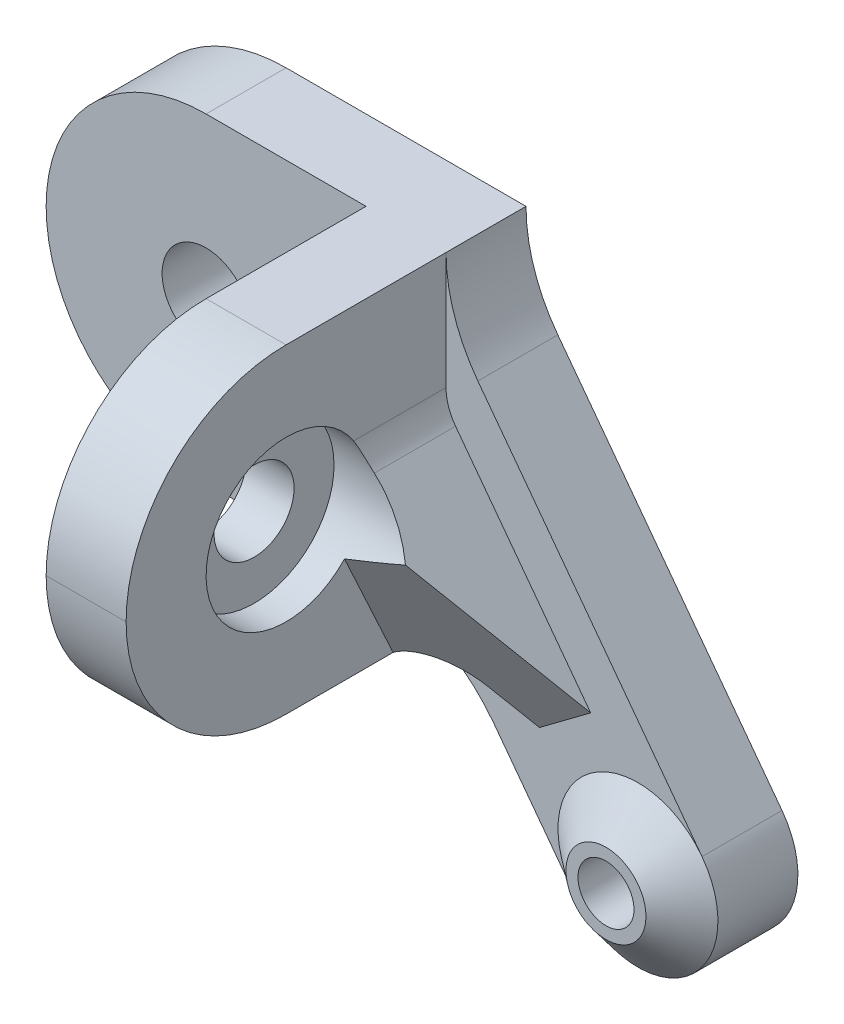
ISO-10303-21;
HEADER;
FILE_DESCRIPTION(('STEP AP214'),'2;1');
FILE_NAME('part.step','',(''),(''),'','','');
FILE_SCHEMA(('AUTOMOTIVE_DESIGN { 1 0 10303 214 1 1 1 1 }'));
ENDSEC;
DATA;
#1=APPLICATION_CONTEXT('core data for automotive mechanical design processes');
#2=APPLICATION_PROTOCOL_DEFINITION('international standard','automotive_design',2000,#1);
#3=PRODUCT_CONTEXT('',#1,'mechanical');
#4=PRODUCT('Part','Part','',(#3));
#5=PRODUCT_RELATED_PRODUCT_CATEGORY('part','',(#4));
#6=PRODUCT_DEFINITION_FORMATION('','',#4);
#7=PRODUCT_DEFINITION_CONTEXT('part definition',#1,'design');
#8=PRODUCT_DEFINITION('design','',#6,#7);
#9=PRODUCT_DEFINITION_SHAPE('','',#8);
#10=(LENGTH_UNIT() NAMED_UNIT(*) SI_UNIT(.MILLI.,.METRE.));
#11=(NAMED_UNIT(*) PLANE_ANGLE_UNIT() SI_UNIT($,.RADIAN.));
#12=(NAMED_UNIT(*) SI_UNIT($,.STERADIAN.) SOLID_ANGLE_UNIT());
#13=UNCERTAINTY_MEASURE_WITH_UNIT(LENGTH_MEASURE(1.E-05),#10,'distance_accuracy_value','');
#14=(GEOMETRIC_REPRESENTATION_CONTEXT(3) GLOBAL_UNCERTAINTY_ASSIGNED_CONTEXT((#13)) GLOBAL_UNIT_ASSIGNED_CONTEXT((#10,
#11,#12)) REPRESENTATION_CONTEXT('',''));
#15=CARTESIAN_POINT('',(0.,0.,0.));
#16=DIRECTION('',(0.,0.,1.));
#17=DIRECTION('',(1.,0.,0.));
#18=AXIS2_PLACEMENT_3D('',#15,#16,#17);
#19=CARTESIAN_POINT('',(5.00000000000001,12.7,0.));
#20=DIRECTION('',(0.,1.,0.));
#21=DIRECTION('',(0.,0.,1.));
#22=AXIS2_PLACEMENT_3D('',#19,#20,#21);
#23=PLANE('',#22);
#24=DIRECTION('',(-1.,0.,0.));
#25=VECTOR('',#24,1.);
#26=CARTESIAN_POINT('',(5.00000000000001,12.7,0.));
#27=LINE('',#26,#25);
#28=CARTESIAN_POINT('',(24.9906375905158,12.7,0.));
#29=VERTEX_POINT('',#28);
#30=CARTESIAN_POINT('',(15.,12.7,0.));
#31=VERTEX_POINT('',#30);
#32=EDGE_CURVE('E416',#29,#31,#27,.T.);
#33=ORIENTED_EDGE('',*,*,#32,.F.);
#34=DIRECTION('',(0.,0.,1.));
#35=VECTOR('',#34,1.);
#36=CARTESIAN_POINT('',(24.9906375905158,12.7,5.));
#37=LINE('',#36,#35);
#38=CARTESIAN_POINT('',(24.9906375905158,12.7,4.99999999999999));
#39=VERTEX_POINT('',#38);
#40=EDGE_CURVE('E209',#29,#39,#37,.T.);
#41=ORIENTED_EDGE('',*,*,#40,.T.);
#42=DIRECTION('',(1.,0.,0.));
#43=VECTOR('',#42,1.);
#44=CARTESIAN_POINT('',(5.,12.7,4.99999999999999));
#45=LINE('',#44,#43);
#46=CARTESIAN_POINT('',(15.,12.7,4.99999999999999));
#47=VERTEX_POINT('',#46);
#48=EDGE_CURVE('E427',#47,#39,#45,.T.);
#49=ORIENTED_EDGE('',*,*,#48,.F.);
#50=DIRECTION('',(0.,0.,1.));
#51=VECTOR('',#50,1.);
#52=CARTESIAN_POINT('',(15.,12.7,0.));
#53=LINE('',#52,#51);
#54=EDGE_CURVE('E204',#47,#31,#53,.F.);
#55=ORIENTED_EDGE('',*,*,#54,.T.);
#56=EDGE_LOOP('',(#33,#41,#49,#55));
#57=FACE_BOUND('',#56,.T.);
#58=ADVANCED_FACE('F33',(#57),#23,.F.);
#59=CARTESIAN_POINT('',(5.,32.7,4.99999999999999));
#60=DIRECTION('',(0.,0.,-1.));
#61=DIRECTION('',(-1.,0.,0.));
#62=AXIS2_PLACEMENT_3D('',#59,#60,#61);
#63=PLANE('',#62);
#64=DIRECTION('',(0.598801388197791,-0.800897557426915,0.));
#65=VECTOR('',#64,1.);
#66=CARTESIAN_POINT('',(13.8470437257616,39.3146063442278,4.99999999999999));
#67=LINE('',#66,#65);
#68=CARTESIAN_POINT('',(34.1990968368741,12.0937114923126,4.99999999999999));
#69=VERTEX_POINT('',#68);
#70=CARTESIAN_POINT('',(35.8387488744465,9.90067497335245,5.));
#71=VERTEX_POINT('',#70);
#72=EDGE_CURVE('E273',#69,#71,#67,.T.);
#73=ORIENTED_EDGE('',*,*,#72,.F.);
#74=CARTESIAN_POINT('',(31.7964041645934,10.2973073277193,4.99999999999999));
#75=DIRECTION('',(0.,0.,-1.));
#76=DIRECTION('',(-1.,0.,0.));
#77=AXIS2_PLACEMENT_3D('',#74,#75,#76);
#78=CIRCLE('',#77,3.);
#79=CARTESIAN_POINT('',(30.,12.7,5.));
#80=VERTEX_POINT('',#79);
#81=EDGE_CURVE('E259',#69,#80,#78,.F.);
#82=ORIENTED_EDGE('',*,*,#81,.T.);
#83=DIRECTION('',(1.,0.,0.));
#84=VECTOR('',#83,1.);
#85=CARTESIAN_POINT('',(5.,12.7,4.99999999999999));
#86=LINE('',#85,#84);
#87=CARTESIAN_POINT('',(25.,12.7,5.));
#88=VERTEX_POINT('',#87);
#89=EDGE_CURVE('E206',#88,#80,#86,.T.);
#90=ORIENTED_EDGE('',*,*,#89,.F.);
#91=CARTESIAN_POINT('',(24.9906375905158,2.7,4.99999999999999));
#92=DIRECTION('',(0.,0.,-1.));
#93=DIRECTION('',(-1.,0.,0.));
#94=AXIS2_PLACEMENT_3D('',#91,#92,#93);
#95=CIRCLE('',#94,10.);
#96=CARTESIAN_POINT('',(32.999613164785,8.68801388197789,4.99999999999999));
#97=VERTEX_POINT('',#96);
#98=EDGE_CURVE('E239',#88,#97,#95,.T.);
#99=ORIENTED_EDGE('',*,*,#98,.T.);
#100=DIRECTION('',(0.598801388197791,-0.800897557426915,0.));
#101=VECTOR('',#100,1.);
#102=CARTESIAN_POINT('',(11.4443510534808,37.5182021796344,4.99999999999999));
#103=LINE('',#102,#101);
#104=CARTESIAN_POINT('',(37.9955122128654,2.00599305901105,4.99999999999999));
#105=VERTEX_POINT('',#104);
#106=EDGE_CURVE('E303',#97,#105,#103,.T.);
#107=ORIENTED_EDGE('',*,*,#106,.T.);
#108=CARTESIAN_POINT('',(42.,5.,4.99999999999999));
#109=DIRECTION('',(0.,0.,-1.));
#110=DIRECTION('',(-1.,0.,0.));
#111=AXIS2_PLACEMENT_3D('',#108,#109,#110);
#112=CIRCLE('',#111,5.);
#113=CARTESIAN_POINT('',(46.0044877871346,7.99400694098895,4.99999999999999));
#114=VERTEX_POINT('',#113);
#115=EDGE_CURVE('E195',#105,#114,#112,.T.);
#116=ORIENTED_EDGE('',*,*,#115,.T.);
#117=DIRECTION('',(-0.598801388197791,0.800897557426915,0.));
#118=VECTOR('',#117,1.);
#119=CARTESIAN_POINT('',(19.45332662775,43.5062160616123,4.99999999999999));
#120=LINE('',#119,#118);
#121=CARTESIAN_POINT('',(31.9909929589213,26.7370726721985,4.99999999999999));
#122=VERTEX_POINT('',#121);
#123=EDGE_CURVE('E306',#114,#122,#120,.T.);
#124=ORIENTED_EDGE('',*,*,#123,.T.);
#125=CARTESIAN_POINT('',(39.9999685331905,32.7250865541764,4.99999999999999));
#126=DIRECTION('',(0.,0.,-1.));
#127=DIRECTION('',(-1.,0.,0.));
#128=AXIS2_PLACEMENT_3D('',#125,#126,#127);
#129=CIRCLE('',#128,10.);
#130=CARTESIAN_POINT('',(30.,32.7,4.99999999999999));
#131=VERTEX_POINT('',#130);
#132=EDGE_CURVE('E243',#122,#131,#129,.T.);
#133=ORIENTED_EDGE('',*,*,#132,.T.);
#134=DIRECTION('',(0.,1.,0.));
#135=VECTOR('',#134,1.);
#136=CARTESIAN_POINT('',(30.,0.,4.99999999999999));
#137=LINE('',#136,#135);
#138=CARTESIAN_POINT('',(30.,25.3875245740242,4.99999999999999));
#139=VERTEX_POINT('',#138);
#140=EDGE_CURVE('E302',#139,#131,#137,.T.);
#141=ORIENTED_EDGE('',*,*,#140,.F.);
#142=CARTESIAN_POINT('',(33.,25.3875245740242,4.99999999999999));
#143=DIRECTION('',(0.,0.,-1.));
#144=DIRECTION('',(-1.,0.,0.));
#145=AXIS2_PLACEMENT_3D('',#142,#143,#144);
#146=CIRCLE('',#145,3.);
#147=CARTESIAN_POINT('',(30.5973073277193,23.5911204094308,4.99999999999999));
#148=VERTEX_POINT('',#147);
#149=EDGE_CURVE('E257',#139,#148,#146,.F.);
#150=ORIENTED_EDGE('',*,*,#149,.T.);
#151=DIRECTION('',(0.598801388197791,-0.800897557426915,0.));
#152=VECTOR('',#151,1.);
#153=CARTESIAN_POINT('',(17.0506339554692,41.7098118970189,4.99999999999999));
#154=LINE('',#153,#152);
#155=CARTESIAN_POINT('',(39.0423391041542,12.2958805261436,5.));
#156=VERTEX_POINT('',#155);
#157=EDGE_CURVE('E275',#148,#156,#154,.T.);
#158=ORIENTED_EDGE('',*,*,#157,.T.);
#159=DIRECTION('',(-0.800897557426915,-0.598801388197791,0.));
#160=VECTOR('',#159,1.);
#161=CARTESIAN_POINT('',(26.991705148685,3.28606862912467,4.99999999999999));
#162=LINE('',#161,#160);
#163=EDGE_CURVE('E448',#156,#71,#162,.T.);
#164=ORIENTED_EDGE('',*,*,#163,.T.);
#165=EDGE_LOOP('',(#73,#82,#90,#99,#107,#116,#124,#133,#141,#150,#158,#164));
#166=FACE_BOUND('',#165,.T.);
#167=ADVANCED_FACE('F281',(#166),#63,.F.);
#168=CARTESIAN_POINT('',(30.,0.,25.));
#169=DIRECTION('',(-1.,0.,0.));
#170=DIRECTION('',(0.,0.,1.));
#171=AXIS2_PLACEMENT_3D('',#168,#169,#170);
#172=PLANE('',#171);
#173=DIRECTION('',(0.,0.,1.));
#174=VECTOR('',#173,1.);
#175=CARTESIAN_POINT('',(30.,12.7,0.));
#176=LINE('',#175,#174);
#177=CARTESIAN_POINT('',(30.,12.7,8.30783445332814));
#178=VERTEX_POINT('',#177);
#179=CARTESIAN_POINT('',(30.,12.7,15.));
#180=VERTEX_POINT('',#179);
#181=EDGE_CURVE('E187',#178,#180,#176,.T.);
#182=ORIENTED_EDGE('',*,*,#181,.F.);
#183=DIRECTION('',(0.,0.907909670834868,0.419165873616306));
#184=VECTOR('',#183,1.);
#185=CARTESIAN_POINT('',(30.,8.58384018988373,6.40747610472154));
#186=LINE('',#185,#184);
#187=CARTESIAN_POINT('',(30.,19.2849251009991,11.3479781717226));
#188=VERTEX_POINT('',#187);
#189=EDGE_CURVE('E179',#178,#188,#186,.T.);
#190=ORIENTED_EDGE('',*,*,#189,.T.);
#191=CARTESIAN_POINT('',(30.,22.7,15.));
#192=DIRECTION('',(-1.,0.,0.));
#193=DIRECTION('',(0.,0.,1.));
#194=AXIS2_PLACEMENT_3D('',#191,#192,#193);
#195=CIRCLE('',#194,5.);
#196=CARTESIAN_POINT('',(30.,25.3875245740242,10.7836969198104));
#197=VERTEX_POINT('',#196);
#198=EDGE_CURVE('E166',#197,#188,#195,.F.);
#199=ORIENTED_EDGE('',*,*,#198,.F.);
#200=DIRECTION('',(0.,0.,-1.));
#201=VECTOR('',#200,1.);
#202=CARTESIAN_POINT('',(30.,25.3875245740242,25.));
#203=LINE('',#202,#201);
#204=EDGE_CURVE('E261',#197,#139,#203,.T.);
#205=ORIENTED_EDGE('',*,*,#204,.T.);
#206=ORIENTED_EDGE('',*,*,#140,.T.);
#207=DIRECTION('',(0.,0.,-1.));
#208=VECTOR('',#207,1.);
#209=CARTESIAN_POINT('',(30.,32.7,25.));
#210=LINE('',#209,#208);
#211=CARTESIAN_POINT('',(30.,32.7,15.));
#212=VERTEX_POINT('',#211);
#213=EDGE_CURVE('E313',#212,#131,#210,.T.);
#214=ORIENTED_EDGE('',*,*,#213,.F.);
#215=CARTESIAN_POINT('',(30.,22.7,15.));
#216=DIRECTION('',(-1.,0.,0.));
#217=DIRECTION('',(0.,0.,1.));
#218=AXIS2_PLACEMENT_3D('',#215,#216,#217);
#219=CIRCLE('',#218,10.);
#220=CARTESIAN_POINT('',(30.,22.7,25.));
#221=VERTEX_POINT('',#220);
#222=EDGE_CURVE('E219',#212,#221,#219,.F.);
#223=ORIENTED_EDGE('',*,*,#222,.T.);
#224=CARTESIAN_POINT('',(30.,22.7,15.));
#225=DIRECTION('',(-1.,0.,0.));
#226=DIRECTION('',(0.,0.,1.));
#227=AXIS2_PLACEMENT_3D('',#224,#225,#226);
#228=CIRCLE('',#227,10.);
#229=EDGE_CURVE('E217',#221,#180,#228,.F.);
#230=ORIENTED_EDGE('',*,*,#229,.T.);
#231=EDGE_LOOP('',(#182,#190,#199,#205,#206,#214,#223,#230));
#232=FACE_BOUND('',#231,.T.);
#233=ADVANCED_FACE('F185',(#232),#172,.F.);
#234=CARTESIAN_POINT('',(15.,22.7,4.99999999999999));
#235=DIRECTION('',(0.,0.,1.));
#236=DIRECTION('',(1.,0.,0.));
#237=AXIS2_PLACEMENT_3D('',#234,#235,#236);
#238=CIRCLE('',#237,2.75);
#239=CARTESIAN_POINT('',(17.75,22.7,4.99999999999999));
#240=VERTEX_POINT('',#239);
#241=EDGE_CURVE('E330',#240,#240,#238,.T.);
#242=ORIENTED_EDGE('',*,*,#241,.F.);
#243=EDGE_LOOP('',(#242));
#244=FACE_BOUND('',#243,.T.);
#245=DIRECTION('',(1.,0.,0.));
#246=VECTOR('',#245,1.);
#247=CARTESIAN_POINT('',(5.,32.7,4.99999999999999));
#248=LINE('',#247,#246);
#249=CARTESIAN_POINT('',(15.,32.7,4.99999999999999));
#250=VERTEX_POINT('',#249);
#251=CARTESIAN_POINT('',(25.,32.7,4.99999999999999));
#252=VERTEX_POINT('',#251);
#253=EDGE_CURVE('E336',#250,#252,#248,.T.);
#254=ORIENTED_EDGE('',*,*,#253,.F.);
#255=CARTESIAN_POINT('',(15.,22.7,4.99999999999999));
#256=DIRECTION('',(0.,0.,-1.));
#257=DIRECTION('',(-1.,0.,0.));
#258=AXIS2_PLACEMENT_3D('',#255,#256,#257);
#259=CIRCLE('',#258,10.);
#260=CARTESIAN_POINT('',(5.,22.7,4.99999999999999));
#261=VERTEX_POINT('',#260);
#262=EDGE_CURVE('E229',#250,#261,#259,.F.);
#263=ORIENTED_EDGE('',*,*,#262,.T.);
#264=CARTESIAN_POINT('',(15.,22.7,4.99999999999999));
#265=DIRECTION('',(0.,0.,-1.));
#266=DIRECTION('',(-1.,0.,0.));
#267=AXIS2_PLACEMENT_3D('',#264,#265,#266);
#268=CIRCLE('',#267,10.);
#269=EDGE_CURVE('E227',#261,#47,#268,.F.);
#270=ORIENTED_EDGE('',*,*,#269,.T.);
#271=ORIENTED_EDGE('',*,*,#48,.T.);
#272=EDGE_CURVE('E292',#39,#88,#45,.T.);
#273=ORIENTED_EDGE('',*,*,#272,.T.);
#274=DIRECTION('',(0.,-1.,0.));
#275=VECTOR('',#274,1.);
#276=CARTESIAN_POINT('',(25.,0.,4.99999999999999));
#277=LINE('',#276,#275);
#278=EDGE_CURVE('E295',#252,#88,#277,.T.);
#279=ORIENTED_EDGE('',*,*,#278,.F.);
#280=EDGE_LOOP('',(#254,#263,#270,#271,#273,#279));
#281=FACE_BOUND('',#280,.T.);
#282=ADVANCED_FACE('F345',(#244,#281),#63,.F.);
#283=CARTESIAN_POINT('',(15.,22.7,-5.00000000000001));
#284=DIRECTION('',(0.,0.,1.));
#285=DIRECTION('',(1.,0.,0.));
#286=AXIS2_PLACEMENT_3D('',#283,#284,#285);
#287=CYLINDRICAL_SURFACE('',#286,2.75);
#288=ORIENTED_EDGE('',*,*,#241,.T.);
#289=EDGE_LOOP('',(#288));
#290=FACE_BOUND('',#289,.T.);
#291=CARTESIAN_POINT('',(15.,22.7,0.999999999999998));
#292=DIRECTION('',(0.,0.,-1.));
#293=DIRECTION('',(-1.,0.,0.));
#294=AXIS2_PLACEMENT_3D('',#291,#292,#293);
#295=CIRCLE('',#294,2.75);
#296=CARTESIAN_POINT('',(12.25,22.7,0.999999999999999));
#297=VERTEX_POINT('',#296);
#298=EDGE_CURVE('E327',#297,#297,#295,.F.);
#299=ORIENTED_EDGE('',*,*,#298,.F.);
#300=EDGE_LOOP('',(#299));
#301=FACE_BOUND('',#300,.T.);
#302=ADVANCED_FACE('F342',(#290,#301),#287,.F.);
#303=CARTESIAN_POINT('',(47.,32.7,0.));
#304=DIRECTION('',(0.,0.,1.));
#305=DIRECTION('',(1.,0.,0.));
#306=AXIS2_PLACEMENT_3D('',#303,#304,#305);
#307=PLANE('',#306);
#308=CARTESIAN_POINT('',(42.,5.,0.));
#309=DIRECTION('',(0.,0.,-1.));
#310=DIRECTION('',(-1.,0.,0.));
#311=AXIS2_PLACEMENT_3D('',#308,#309,#310);
#312=CIRCLE('',#311,1.75);
#313=CARTESIAN_POINT('',(40.25,5.,0.));
#314=VERTEX_POINT('',#313);
#315=EDGE_CURVE('E320',#314,#314,#312,.T.);
#316=ORIENTED_EDGE('',*,*,#315,.F.);
#317=EDGE_LOOP('',(#316));
#318=FACE_BOUND('',#317,.T.);
#319=CARTESIAN_POINT('',(15.,22.7,0.));
#320=DIRECTION('',(0.,0.,-1.));
#321=DIRECTION('',(-1.,0.,0.));
#322=AXIS2_PLACEMENT_3D('',#319,#320,#321);
#323=CIRCLE('',#322,5.5);
#324=CARTESIAN_POINT('',(9.50000000000001,22.7,0.));
#325=VERTEX_POINT('',#324);
#326=EDGE_CURVE('E323',#325,#325,#323,.T.);
#327=ORIENTED_EDGE('',*,*,#326,.F.);
#328=EDGE_LOOP('',(#327));
#329=FACE_BOUND('',#328,.T.);
#330=CARTESIAN_POINT('',(15.,22.7,0.));
#331=DIRECTION('',(0.,0.,1.));
#332=DIRECTION('',(1.,0.,0.));
#333=AXIS2_PLACEMENT_3D('',#330,#331,#332);
#334=CIRCLE('',#333,10.);
#335=CARTESIAN_POINT('',(5.00000000000001,22.7,0.));
#336=VERTEX_POINT('',#335);
#337=EDGE_CURVE('E231',#31,#336,#334,.F.);
#338=ORIENTED_EDGE('',*,*,#337,.T.);
#339=CARTESIAN_POINT('',(15.,22.7,0.));
#340=DIRECTION('',(0.,0.,1.));
#341=DIRECTION('',(1.,0.,0.));
#342=AXIS2_PLACEMENT_3D('',#339,#340,#341);
#343=CIRCLE('',#342,10.);
#344=CARTESIAN_POINT('',(15.,32.7,0.));
#345=VERTEX_POINT('',#344);
#346=EDGE_CURVE('E233',#336,#345,#343,.F.);
#347=ORIENTED_EDGE('',*,*,#346,.T.);
#348=DIRECTION('',(-1.,0.,0.));
#349=VECTOR('',#348,1.);
#350=CARTESIAN_POINT('',(47.,32.7,0.));
#351=LINE('',#350,#349);
#352=CARTESIAN_POINT('',(30.,32.7,0.));
#353=VERTEX_POINT('',#352);
#354=EDGE_CURVE('E333',#353,#345,#351,.T.);
#355=ORIENTED_EDGE('',*,*,#354,.F.);
#356=CARTESIAN_POINT('',(39.9999685331905,32.7250865541764,0.));
#357=DIRECTION('',(0.,0.,1.));
#358=DIRECTION('',(1.,0.,0.));
#359=AXIS2_PLACEMENT_3D('',#356,#357,#358);
#360=CIRCLE('',#359,10.);
#361=CARTESIAN_POINT('',(31.9909929589213,26.7370726721985,0.));
#362=VERTEX_POINT('',#361);
#363=EDGE_CURVE('E246',#353,#362,#360,.T.);
#364=ORIENTED_EDGE('',*,*,#363,.T.);
#365=DIRECTION('',(0.598801388197791,-0.800897557426915,0.));
#366=VECTOR('',#365,1.);
#367=CARTESIAN_POINT('',(46.0044877871346,7.99400694098895,0.));
#368=LINE('',#367,#366);
#369=CARTESIAN_POINT('',(46.0044877871346,7.99400694098895,0.));
#370=VERTEX_POINT('',#369);
#371=EDGE_CURVE('E446',#362,#370,#368,.T.);
#372=ORIENTED_EDGE('',*,*,#371,.T.);
#373=CARTESIAN_POINT('',(42.,5.,0.));
#374=DIRECTION('',(0.,0.,-1.));
#375=DIRECTION('',(1.,0.,0.));
#376=AXIS2_PLACEMENT_3D('',#373,#374,#375);
#377=CIRCLE('',#376,4.99999999999999);
#378=CARTESIAN_POINT('',(37.9955122128654,2.00599305901105,0.));
#379=VERTEX_POINT('',#378);
#380=EDGE_CURVE('E443',#370,#379,#377,.T.);
#381=ORIENTED_EDGE('',*,*,#380,.T.);
#382=DIRECTION('',(-0.598801388197791,0.800897557426915,0.));
#383=VECTOR('',#382,1.);
#384=CARTESIAN_POINT('',(30.,12.7,0.));
#385=LINE('',#384,#383);
#386=CARTESIAN_POINT('',(32.999613164785,8.68801388197791,0.));
#387=VERTEX_POINT('',#386);
#388=EDGE_CURVE('E440',#379,#387,#385,.T.);
#389=ORIENTED_EDGE('',*,*,#388,.T.);
#390=CARTESIAN_POINT('',(24.9906375905158,2.7,0.));
#391=DIRECTION('',(0.,0.,1.));
#392=DIRECTION('',(1.,0.,0.));
#393=AXIS2_PLACEMENT_3D('',#390,#391,#392);
#394=CIRCLE('',#393,10.);
#395=EDGE_CURVE('E241',#387,#29,#394,.T.);
#396=ORIENTED_EDGE('',*,*,#395,.T.);
#397=ORIENTED_EDGE('',*,*,#32,.T.);
#398=EDGE_LOOP('',(#338,#347,#355,#364,#372,#381,#389,#396,#397));
#399=FACE_BOUND('',#398,.T.);
#400=ADVANCED_FACE('F344',(#318,#329,#399),#307,.F.);
#401=CARTESIAN_POINT('',(0.,32.7,0.));
#402=DIRECTION('',(0.,1.,0.));
#403=DIRECTION('',(0.,0.,1.));
#404=AXIS2_PLACEMENT_3D('',#401,#402,#403);
#405=PLANE('',#404);
#406=ORIENTED_EDGE('',*,*,#354,.T.);
#407=DIRECTION('',(0.,0.,1.));
#408=VECTOR('',#407,1.);
#409=CARTESIAN_POINT('',(15.,32.7,4.99999999999999));
#410=LINE('',#409,#408);
#411=EDGE_CURVE('E224',#345,#250,#410,.T.);
#412=ORIENTED_EDGE('',*,*,#411,.T.);
#413=ORIENTED_EDGE('',*,*,#253,.T.);
#414=DIRECTION('',(0.,0.,-1.));
#415=VECTOR('',#414,1.);
#416=CARTESIAN_POINT('',(25.,32.7,25.));
#417=LINE('',#416,#415);
#418=CARTESIAN_POINT('',(25.,32.7,15.));
#419=VERTEX_POINT('',#418);
#420=EDGE_CURVE('E298',#419,#252,#417,.T.);
#421=ORIENTED_EDGE('',*,*,#420,.F.);
#422=DIRECTION('',(-1.,0.,0.));
#423=VECTOR('',#422,1.);
#424=CARTESIAN_POINT('',(30.,32.7,15.));
#425=LINE('',#424,#423);
#426=EDGE_CURVE('E221',#419,#212,#425,.F.);
#427=ORIENTED_EDGE('',*,*,#426,.T.);
#428=ORIENTED_EDGE('',*,*,#213,.T.);
#429=EDGE_CURVE('E311',#131,#353,#210,.T.);
#430=ORIENTED_EDGE('',*,*,#429,.T.);
#431=EDGE_LOOP('',(#406,#412,#413,#421,#427,#428,#430));
#432=FACE_BOUND('',#431,.T.);
#433=ADVANCED_FACE('F352',(#432),#405,.T.);
#434=CARTESIAN_POINT('',(15.,22.7,0.999999999999998));
#435=DIRECTION('',(0.,0.,-1.));
#436=DIRECTION('',(-1.,0.,0.));
#437=AXIS2_PLACEMENT_3D('',#434,#435,#436);
#438=PLANE('',#437);
#439=CARTESIAN_POINT('',(15.,22.7,0.999999999999998));
#440=DIRECTION('',(0.,0.,-1.));
#441=DIRECTION('',(-1.,0.,0.));
#442=AXIS2_PLACEMENT_3D('',#439,#440,#441);
#443=CIRCLE('',#442,5.5);
#444=CARTESIAN_POINT('',(9.50000000000001,22.7,0.999999999999999));
#445=VERTEX_POINT('',#444);
#446=EDGE_CURVE('E324',#445,#445,#443,.T.);
#447=ORIENTED_EDGE('',*,*,#446,.T.);
#448=EDGE_LOOP('',(#447));
#449=FACE_BOUND('',#448,.T.);
#450=ORIENTED_EDGE('',*,*,#298,.T.);
#451=EDGE_LOOP('',(#450));
#452=FACE_BOUND('',#451,.T.);
#453=ADVANCED_FACE('F340',(#449,#452),#438,.T.);
#454=CARTESIAN_POINT('',(15.,22.7,0.999999999999998));
#455=DIRECTION('',(0.,0.,-1.));
#456=DIRECTION('',(-1.,0.,0.));
#457=AXIS2_PLACEMENT_3D('',#454,#455,#456);
#458=CYLINDRICAL_SURFACE('',#457,5.5);
#459=ORIENTED_EDGE('',*,*,#446,.F.);
#460=EDGE_LOOP('',(#459));
#461=FACE_BOUND('',#460,.T.);
#462=ORIENTED_EDGE('',*,*,#326,.T.);
#463=EDGE_LOOP('',(#462));
#464=FACE_BOUND('',#463,.T.);
#465=ADVANCED_FACE('F398',(#461,#464),#458,.F.);
#466=CARTESIAN_POINT('',(42.,5.,12.));
#467=DIRECTION('',(0.,0.,-1.));
#468=DIRECTION('',(-1.,0.,0.));
#469=AXIS2_PLACEMENT_3D('',#466,#467,#468);
#470=CYLINDRICAL_SURFACE('',#469,1.75);
#471=ORIENTED_EDGE('',*,*,#315,.T.);
#472=EDGE_LOOP('',(#471));
#473=FACE_BOUND('',#472,.T.);
#474=CARTESIAN_POINT('',(42.,5.,6.99999999999999));
#475=DIRECTION('',(0.,0.,1.));
#476=DIRECTION('',(1.,0.,0.));
#477=AXIS2_PLACEMENT_3D('',#474,#475,#476);
#478=CIRCLE('',#477,1.75);
#479=CARTESIAN_POINT('',(43.75,5.,6.99999999999999));
#480=VERTEX_POINT('',#479);
#481=EDGE_CURVE('E314',#480,#480,#478,.T.);
#482=ORIENTED_EDGE('',*,*,#481,.T.);
#483=EDGE_LOOP('',(#482));
#484=FACE_BOUND('',#483,.T.);
#485=ADVANCED_FACE('F394',(#473,#484),#470,.F.);
#486=CARTESIAN_POINT('',(42.,5.,6.99999999999999));
#487=DIRECTION('',(0.,0.,1.));
#488=DIRECTION('',(1.,0.,0.));
#489=AXIS2_PLACEMENT_3D('',#486,#487,#488);
#490=PLANE('',#489);
#491=CARTESIAN_POINT('',(42.,5.,6.99999999999999));
#492=DIRECTION('',(0.,0.,1.));
#493=DIRECTION('',(1.,0.,0.));
#494=AXIS2_PLACEMENT_3D('',#491,#492,#493);
#495=CIRCLE('',#494,2.5);
#496=CARTESIAN_POINT('',(44.5,5.,6.99999999999999));
#497=VERTEX_POINT('',#496);
#498=EDGE_CURVE('E317',#497,#497,#495,.T.);
#499=ORIENTED_EDGE('',*,*,#498,.T.);
#500=EDGE_LOOP('',(#499));
#501=FACE_BOUND('',#500,.T.);
#502=ORIENTED_EDGE('',*,*,#481,.F.);
#503=EDGE_LOOP('',(#502));
#504=FACE_BOUND('',#503,.T.);
#505=ADVANCED_FACE('F391',(#501,#504),#490,.T.);
#506=CARTESIAN_POINT('',(42.,5.,6.99999999999999));
#507=DIRECTION('',(0.,0.,-1.));
#508=DIRECTION('',(-1.,0.,0.));
#509=AXIS2_PLACEMENT_3D('',#506,#507,#508);
#510=CONICAL_SURFACE('',#509,2.5,0.896055384571343);
#511=EDGE_CURVE('E190',#114,#105,#112,.T.);
#512=ORIENTED_EDGE('',*,*,#511,.F.);
#513=ORIENTED_EDGE('',*,*,#115,.F.);
#514=EDGE_LOOP('',(#512,#513));
#515=FACE_BOUND('',#514,.T.);
#516=ORIENTED_EDGE('',*,*,#498,.F.);
#517=EDGE_LOOP('',(#516));
#518=FACE_BOUND('',#517,.T.);
#519=ADVANCED_FACE('F389',(#515,#518),#510,.T.);
#520=CARTESIAN_POINT('',(25.,0.,25.));
#521=DIRECTION('',(1.,0.,0.));
#522=DIRECTION('',(0.,0.,-1.));
#523=AXIS2_PLACEMENT_3D('',#520,#521,#522);
#524=PLANE('',#523);
#525=CARTESIAN_POINT('',(25.,22.7,15.));
#526=DIRECTION('',(1.,0.,0.));
#527=DIRECTION('',(0.,0.,-1.));
#528=AXIS2_PLACEMENT_3D('',#525,#526,#527);
#529=CIRCLE('',#528,2.5);
#530=CARTESIAN_POINT('',(25.,22.7,12.5));
#531=VERTEX_POINT('',#530);
#532=EDGE_CURVE('E199',#531,#531,#529,.T.);
#533=ORIENTED_EDGE('',*,*,#532,.T.);
#534=EDGE_LOOP('',(#533));
#535=FACE_BOUND('',#534,.T.);
#536=CARTESIAN_POINT('',(25.,22.7,15.));
#537=DIRECTION('',(1.,0.,0.));
#538=DIRECTION('',(0.,0.,-1.));
#539=AXIS2_PLACEMENT_3D('',#536,#537,#538);
#540=CIRCLE('',#539,10.);
#541=CARTESIAN_POINT('',(25.,12.7,15.));
#542=VERTEX_POINT('',#541);
#543=CARTESIAN_POINT('',(25.,22.7,25.));
#544=VERTEX_POINT('',#543);
#545=EDGE_CURVE('E235',#542,#544,#540,.F.);
#546=ORIENTED_EDGE('',*,*,#545,.T.);
#547=CARTESIAN_POINT('',(25.,22.7,15.));
#548=DIRECTION('',(1.,0.,0.));
#549=DIRECTION('',(0.,0.,-1.));
#550=AXIS2_PLACEMENT_3D('',#547,#548,#549);
#551=CIRCLE('',#550,10.);
#552=EDGE_CURVE('E237',#544,#419,#551,.F.);
#553=ORIENTED_EDGE('',*,*,#552,.T.);
#554=ORIENTED_EDGE('',*,*,#420,.T.);
#555=ORIENTED_EDGE('',*,*,#278,.T.);
#556=DIRECTION('',(0.,0.,1.));
#557=VECTOR('',#556,1.);
#558=CARTESIAN_POINT('',(25.,12.7,25.));
#559=LINE('',#558,#557);
#560=EDGE_CURVE('E287',#88,#542,#559,.T.);
#561=ORIENTED_EDGE('',*,*,#560,.T.);
#562=EDGE_LOOP('',(#546,#553,#554,#555,#561));
#563=FACE_BOUND('',#562,.T.);
#564=ADVANCED_FACE('F296',(#535,#563),#524,.F.);
#565=CARTESIAN_POINT('',(42.,5.,0.));
#566=DIRECTION('',(0.,0.,1.));
#567=DIRECTION('',(1.,0.,0.));
#568=AXIS2_PLACEMENT_3D('',#565,#566,#567);
#569=CYLINDRICAL_SURFACE('',#568,4.99999999999999);
#570=DIRECTION('',(0.,0.,1.));
#571=VECTOR('',#570,1.);
#572=CARTESIAN_POINT('',(37.9955122128654,2.00599305901105,0.));
#573=LINE('',#572,#571);
#574=EDGE_CURVE('E435',#379,#105,#573,.T.);
#575=ORIENTED_EDGE('',*,*,#574,.F.);
#576=ORIENTED_EDGE('',*,*,#380,.F.);
#577=DIRECTION('',(0.,0.,1.));
#578=VECTOR('',#577,1.);
#579=CARTESIAN_POINT('',(46.0044877871346,7.99400694098895,0.));
#580=LINE('',#579,#578);
#581=EDGE_CURVE('E432',#370,#114,#580,.T.);
#582=ORIENTED_EDGE('',*,*,#581,.T.);
#583=ORIENTED_EDGE('',*,*,#511,.T.);
#584=EDGE_LOOP('',(#575,#576,#582,#583));
#585=FACE_BOUND('',#584,.T.);
#586=ADVANCED_FACE('F380',(#585),#569,.T.);
#587=CARTESIAN_POINT('',(30.,12.7,0.));
#588=DIRECTION('',(0.800897557426915,0.598801388197791,0.));
#589=DIRECTION('',(-0.598801388197791,0.800897557426915,0.));
#590=AXIS2_PLACEMENT_3D('',#587,#588,#589);
#591=PLANE('',#590);
#592=ORIENTED_EDGE('',*,*,#106,.F.);
#593=DIRECTION('',(0.,0.,1.));
#594=VECTOR('',#593,1.);
#595=CARTESIAN_POINT('',(32.999613164785,8.68801388197791,0.));
#596=LINE('',#595,#594);
#597=EDGE_CURVE('E212',#97,#387,#596,.F.);
#598=ORIENTED_EDGE('',*,*,#597,.T.);
#599=ORIENTED_EDGE('',*,*,#388,.F.);
#600=ORIENTED_EDGE('',*,*,#574,.T.);
#601=EDGE_LOOP('',(#592,#598,#599,#600));
#602=FACE_BOUND('',#601,.T.);
#603=ADVANCED_FACE('F374',(#602),#591,.F.);
#604=CARTESIAN_POINT('',(46.0044877871346,7.99400694098895,0.));
#605=DIRECTION('',(-0.800897557426915,-0.598801388197791,0.));
#606=DIRECTION('',(0.598801388197791,-0.800897557426915,0.));
#607=AXIS2_PLACEMENT_3D('',#604,#605,#606);
#608=PLANE('',#607);
#609=ORIENTED_EDGE('',*,*,#371,.F.);
#610=DIRECTION('',(0.,0.,-1.));
#611=VECTOR('',#610,1.);
#612=CARTESIAN_POINT('',(31.9909929589213,26.7370726721985,0.));
#613=LINE('',#612,#611);
#614=EDGE_CURVE('E214',#362,#122,#613,.F.);
#615=ORIENTED_EDGE('',*,*,#614,.T.);
#616=ORIENTED_EDGE('',*,*,#123,.F.);
#617=ORIENTED_EDGE('',*,*,#581,.F.);
#618=EDGE_LOOP('',(#609,#615,#616,#617));
#619=FACE_BOUND('',#618,.T.);
#620=ADVANCED_FACE('F369',(#619),#608,.F.);
#621=ORIENTED_EDGE('',*,*,#560,.F.);
#622=ORIENTED_EDGE('',*,*,#89,.T.);
#623=EDGE_CURVE('E278',#80,#178,#176,.T.);
#624=ORIENTED_EDGE('',*,*,#623,.T.);
#625=ORIENTED_EDGE('',*,*,#181,.T.);
#626=DIRECTION('',(-1.,0.,0.));
#627=VECTOR('',#626,1.);
#628=CARTESIAN_POINT('',(5.00000000000001,12.7,15.));
#629=LINE('',#628,#627);
#630=EDGE_CURVE('E192',#180,#542,#629,.T.);
#631=ORIENTED_EDGE('',*,*,#630,.T.);
#632=EDGE_LOOP('',(#621,#622,#624,#625,#631));
#633=FACE_BOUND('',#632,.T.);
#634=ADVANCED_FACE('F285',(#633),#23,.F.);
#635=CARTESIAN_POINT('',(36.8902385307345,8.49430632762296,3.98774830568982));
#636=DIRECTION('',(0.299052754820834,-0.399983409521895,0.866360618877215));
#637=DIRECTION('',(0.,-0.907909670834868,-0.419165873616306));
#638=AXIS2_PLACEMENT_3D('',#635,#636,#637);
#639=PLANE('',#638);
#640=DIRECTION('',(0.518777941263573,-0.693866103509632,-0.499418940428464));
#641=VECTOR('',#640,1.);
#642=CARTESIAN_POINT('',(40.0938287604421,10.8895118804141,3.98774830568982));
#643=LINE('',#642,#641);
#644=CARTESIAN_POINT('',(33.1437797994418,20.1852104986412,10.6784454459239));
#645=VERTEX_POINT('',#644);
#646=EDGE_CURVE('E175',#645,#156,#643,.T.);
#647=ORIENTED_EDGE('',*,*,#646,.F.);
#648=CARTESIAN_POINT('',(23.9877009643277,22.7,15.));
#649=DIRECTION('',(0.299052754820834,-0.399983409521895,0.866360618877215));
#650=DIRECTION('',(-0.954236579593378,-0.125352709231838,0.271512888191644));
#651=AXIS2_PLACEMENT_3D('',#648,#649,#650);
#652=ELLIPSE('',#651,16.7194580869036,5.);
#653=EDGE_CURVE('E169',#645,#188,#652,.F.);
#654=ORIENTED_EDGE('',*,*,#653,.T.);
#655=ORIENTED_EDGE('',*,*,#189,.F.);
#656=CARTESIAN_POINT('',(31.7964041645934,10.2973073277193,6.57846588712173));
#657=DIRECTION('',(0.299052754820834,-0.399983409521895,0.866360618877215));
#658=DIRECTION('',(0.518777941263574,-0.693866103509632,-0.499418940428464));
#659=AXIS2_PLACEMENT_3D('',#656,#657,#658);
#660=ELLIPSE('',#659,3.46276127357674,3.);
#661=CARTESIAN_POINT('',(34.1990968368741,12.0937114923126,6.57846588712172));
#662=VERTEX_POINT('',#661);
#663=EDGE_CURVE('E46',#178,#662,#660,.F.);
#664=ORIENTED_EDGE('',*,*,#663,.T.);
#665=DIRECTION('',(0.518777941263573,-0.693866103509632,-0.499418940428464));
#666=VECTOR('',#665,1.);
#667=CARTESIAN_POINT('',(36.8902385307345,8.49430632762296,3.98774830568982));
#668=LINE('',#667,#666);
#669=EDGE_CURVE('E265',#662,#71,#668,.T.);
#670=ORIENTED_EDGE('',*,*,#669,.T.);
#671=ORIENTED_EDGE('',*,*,#163,.F.);
#672=EDGE_LOOP('',(#647,#654,#655,#664,#670,#671));
#673=FACE_BOUND('',#672,.T.);
#674=ADVANCED_FACE('F178',(#673),#639,.T.);
#675=CARTESIAN_POINT('',(27.7364474257842,20.7375126421836,0.));
#676=DIRECTION('',(0.800897557426915,0.598801388197791,0.));
#677=DIRECTION('',(-0.598801388197791,0.800897557426915,0.));
#678=AXIS2_PLACEMENT_3D('',#675,#676,#677);
#679=PLANE('',#678);
#680=ORIENTED_EDGE('',*,*,#669,.F.);
#681=DIRECTION('',(0.,0.,-1.));
#682=VECTOR('',#681,1.);
#683=CARTESIAN_POINT('',(34.1990968368741,12.0937114923126,0.));
#684=LINE('',#683,#682);
#685=EDGE_CURVE('E248',#662,#69,#684,.T.);
#686=ORIENTED_EDGE('',*,*,#685,.T.);
#687=ORIENTED_EDGE('',*,*,#72,.T.);
#688=EDGE_LOOP('',(#680,#686,#687));
#689=FACE_BOUND('',#688,.T.);
#690=ADVANCED_FACE('F271',(#689),#679,.F.);
#691=CARTESIAN_POINT('',(30.9400376554919,23.1327181949748,0.));
#692=DIRECTION('',(0.800897557426915,0.598801388197791,0.));
#693=DIRECTION('',(-0.598801388197791,0.800897557426915,0.));
#694=AXIS2_PLACEMENT_3D('',#691,#692,#693);
#695=PLANE('',#694);
#696=ORIENTED_EDGE('',*,*,#157,.F.);
#697=DIRECTION('',(0.,0.,-1.));
#698=VECTOR('',#697,1.);
#699=CARTESIAN_POINT('',(30.5973073277193,23.5911204094308,0.));
#700=LINE('',#699,#698);
#701=CARTESIAN_POINT('',(30.5973073277193,23.5911204094308,10.080050364496));
#702=VERTEX_POINT('',#701);
#703=EDGE_CURVE('E53',#148,#702,#700,.F.);
#704=ORIENTED_EDGE('',*,*,#703,.T.);
#705=CARTESIAN_POINT('',(31.2635649948457,22.7,15.));
#706=DIRECTION('',(0.800897557426915,0.598801388197791,0.));
#707=DIRECTION('',(-0.598801388197791,0.800897557426915,0.));
#708=AXIS2_PLACEMENT_3D('',#705,#706,#707);
#709=ELLIPSE('',#708,6.24299569106411,5.);
#710=EDGE_CURVE('E189',#702,#645,#709,.F.);
#711=ORIENTED_EDGE('',*,*,#710,.T.);
#712=ORIENTED_EDGE('',*,*,#646,.T.);
#713=EDGE_LOOP('',(#696,#704,#711,#712));
#714=FACE_BOUND('',#713,.T.);
#715=ADVANCED_FACE('F468',(#714),#695,.T.);
#716=CARTESIAN_POINT('',(52.,22.7,15.));
#717=DIRECTION('',(-1.,0.,0.));
#718=DIRECTION('',(0.,0.,1.));
#719=AXIS2_PLACEMENT_3D('',#716,#717,#718);
#720=CYLINDRICAL_SURFACE('',#719,5.);
#721=CARTESIAN_POINT('',(28.,22.7,15.));
#722=DIRECTION('',(1.,0.,0.));
#723=DIRECTION('',(0.,0.,-1.));
#724=AXIS2_PLACEMENT_3D('',#721,#722,#723);
#725=CIRCLE('',#724,5.);
#726=CARTESIAN_POINT('',(28.,22.7,9.99999999999999));
#727=VERTEX_POINT('',#726);
#728=EDGE_CURVE('E183',#727,#727,#725,.T.);
#729=ORIENTED_EDGE('',*,*,#728,.F.);
#730=EDGE_LOOP('',(#729));
#731=FACE_BOUND('',#730,.T.);
#732=ORIENTED_EDGE('',*,*,#710,.F.);
#733=CARTESIAN_POINT('',(30.5973073277193,23.5911204094308,10.080050364496));
#734=CARTESIAN_POINT('',(30.5514344598325,23.6524496181735,10.0911490021264));
#735=CARTESIAN_POINT('',(30.5080634534194,23.7153811274809,10.1037410176622));
#736=CARTESIAN_POINT('',(30.4265261735414,23.8438294430653,10.1321507418333));
#737=CARTESIAN_POINT('',(30.3883596437595,23.9093461218193,10.1479682915173));
#738=CARTESIAN_POINT('',(30.3175398560611,24.0421414582407,10.1830136006072));
#739=CARTESIAN_POINT('',(30.2848695549718,24.1094138928617,10.2022304242385));
#740=CARTESIAN_POINT('',(30.224988664655,24.245233794576,10.244233212578));
#741=CARTESIAN_POINT('',(30.1977776148658,24.3137811535785,10.2670188759175));
#742=CARTESIAN_POINT('',(30.1243356430874,24.5204220159547,10.3408833330582));
#743=CARTESIAN_POINT('',(30.0862752414827,24.6595537136324,10.3974796725722));
#744=CARTESIAN_POINT('',(30.030963010695,24.9351928642835,10.5248498598358));
#745=CARTESIAN_POINT('',(30.013692655207,25.0717025468473,10.5956110194231));
#746=CARTESIAN_POINT('',(30.0036838809171,25.2357035078377,10.6905347624064));
#747=CARTESIAN_POINT('',(30.0022922693281,25.2663607615834,10.7087216096919));
#748=CARTESIAN_POINT('',(30.0004516339769,25.3272515351409,10.7457303484903));
#749=CARTESIAN_POINT('',(30.0000011130229,25.3574856518788,10.7645511828309));
#750=CARTESIAN_POINT('',(30.,25.3875245740242,10.7836969198104));
#751=B_SPLINE_CURVE_WITH_KNOTS('',3,(#733,#734,#735,#736,#737,#738,#739,#740,#741,#742,#743,
#744,#745,#746,#747,#748,#749,#750),.UNSPECIFIED.,.F.,.F.,(4,2,2,2,2,2,2,2,4),(0.,
0.232092129189606,0.464172823866509,0.69552004012991,0.926847730917151,1.38936807215993,
1.85147594913681,1.9584855236693,2.0653247253827),.UNSPECIFIED.);
#752=EDGE_CURVE('E11',#702,#197,#751,.T.);
#753=ORIENTED_EDGE('',*,*,#752,.T.);
#754=ORIENTED_EDGE('',*,*,#198,.T.);
#755=ORIENTED_EDGE('',*,*,#653,.F.);
#756=EDGE_LOOP('',(#732,#753,#754,#755));
#757=FACE_BOUND('',#756,.T.);
#758=ADVANCED_FACE('F168',(#731,#757),#720,.F.);
#759=CARTESIAN_POINT('',(28.,22.7,15.));
#760=DIRECTION('',(1.,0.,0.));
#761=DIRECTION('',(0.,0.,-1.));
#762=AXIS2_PLACEMENT_3D('',#759,#760,#761);
#763=PLANE('',#762);
#764=CARTESIAN_POINT('',(28.,22.7,15.));
#765=DIRECTION('',(1.,0.,0.));
#766=DIRECTION('',(0.,0.,-1.));
#767=AXIS2_PLACEMENT_3D('',#764,#765,#766);
#768=CIRCLE('',#767,2.5);
#769=CARTESIAN_POINT('',(28.,22.7,12.5));
#770=VERTEX_POINT('',#769);
#771=EDGE_CURVE('E202',#770,#770,#768,.T.);
#772=ORIENTED_EDGE('',*,*,#771,.F.);
#773=EDGE_LOOP('',(#772));
#774=FACE_BOUND('',#773,.T.);
#775=ORIENTED_EDGE('',*,*,#728,.T.);
#776=EDGE_LOOP('',(#775));
#777=FACE_BOUND('',#776,.T.);
#778=ADVANCED_FACE('F461',(#774,#777),#763,.T.);
#779=CARTESIAN_POINT('',(16.,22.7,15.));
#780=DIRECTION('',(1.,0.,0.));
#781=DIRECTION('',(0.,0.,-1.));
#782=AXIS2_PLACEMENT_3D('',#779,#780,#781);
#783=CYLINDRICAL_SURFACE('',#782,2.5);
#784=ORIENTED_EDGE('',*,*,#771,.T.);
#785=EDGE_LOOP('',(#784));
#786=FACE_BOUND('',#785,.T.);
#787=ORIENTED_EDGE('',*,*,#532,.F.);
#788=EDGE_LOOP('',(#787));
#789=FACE_BOUND('',#788,.T.);
#790=ADVANCED_FACE('F458',(#786,#789),#783,.F.);
#791=CARTESIAN_POINT('',(24.9906375905158,2.7,0.));
#792=DIRECTION('',(0.,0.,-1.));
#793=DIRECTION('',(-1.,0.,0.));
#794=AXIS2_PLACEMENT_3D('',#791,#792,#793);
#795=CYLINDRICAL_SURFACE('',#794,10.);
#796=ORIENTED_EDGE('',*,*,#395,.F.);
#797=ORIENTED_EDGE('',*,*,#597,.F.);
#798=ORIENTED_EDGE('',*,*,#98,.F.);
#799=ORIENTED_EDGE('',*,*,#272,.F.);
#800=ORIENTED_EDGE('',*,*,#40,.F.);
#801=EDGE_LOOP('',(#796,#797,#798,#799,#800));
#802=FACE_BOUND('',#801,.T.);
#803=ADVANCED_FACE('F539',(#802),#795,.F.);
#804=CARTESIAN_POINT('',(39.9999685331905,32.7250865541764,25.));
#805=DIRECTION('',(0.,0.,-1.));
#806=DIRECTION('',(-1.,0.,0.));
#807=AXIS2_PLACEMENT_3D('',#804,#805,#806);
#808=CYLINDRICAL_SURFACE('',#807,10.);
#809=ORIENTED_EDGE('',*,*,#363,.F.);
#810=ORIENTED_EDGE('',*,*,#429,.F.);
#811=ORIENTED_EDGE('',*,*,#132,.F.);
#812=ORIENTED_EDGE('',*,*,#614,.F.);
#813=EDGE_LOOP('',(#809,#810,#811,#812));
#814=FACE_BOUND('',#813,.T.);
#815=ADVANCED_FACE('F522',(#814),#808,.F.);
#816=CARTESIAN_POINT('',(15.,22.7,0.));
#817=DIRECTION('',(0.,0.,1.));
#818=DIRECTION('',(1.,0.,0.));
#819=AXIS2_PLACEMENT_3D('',#816,#817,#818);
#820=CYLINDRICAL_SURFACE('',#819,10.);
#821=DIRECTION('',(0.,0.,1.));
#822=VECTOR('',#821,1.);
#823=CARTESIAN_POINT('',(5.00000000000001,22.7,0.));
#824=LINE('',#823,#822);
#825=EDGE_CURVE('E249',#336,#261,#824,.T.);
#826=ORIENTED_EDGE('',*,*,#825,.F.);
#827=ORIENTED_EDGE('',*,*,#337,.F.);
#828=ORIENTED_EDGE('',*,*,#54,.F.);
#829=ORIENTED_EDGE('',*,*,#269,.F.);
#830=EDGE_LOOP('',(#826,#827,#828,#829));
#831=FACE_BOUND('',#830,.T.);
#832=ADVANCED_FACE('F420',(#831),#820,.T.);
#833=CARTESIAN_POINT('',(15.,22.7,0.));
#834=DIRECTION('',(0.,0.,-1.));
#835=DIRECTION('',(-1.,0.,0.));
#836=AXIS2_PLACEMENT_3D('',#833,#834,#835);
#837=CYLINDRICAL_SURFACE('',#836,10.);
#838=ORIENTED_EDGE('',*,*,#346,.F.);
#839=ORIENTED_EDGE('',*,*,#825,.T.);
#840=ORIENTED_EDGE('',*,*,#262,.F.);
#841=ORIENTED_EDGE('',*,*,#411,.F.);
#842=EDGE_LOOP('',(#838,#839,#840,#841));
#843=FACE_BOUND('',#842,.T.);
#844=ADVANCED_FACE('F423',(#843),#837,.T.);
#845=CARTESIAN_POINT('',(5.00000000000001,22.7,15.));
#846=DIRECTION('',(-1.,0.,0.));
#847=DIRECTION('',(0.,0.,1.));
#848=AXIS2_PLACEMENT_3D('',#845,#846,#847);
#849=CYLINDRICAL_SURFACE('',#848,10.);
#850=ORIENTED_EDGE('',*,*,#630,.F.);
#851=ORIENTED_EDGE('',*,*,#229,.F.);
#852=DIRECTION('',(-1.,0.,0.));
#853=VECTOR('',#852,1.);
#854=CARTESIAN_POINT('',(0.,22.7,25.));
#855=LINE('',#854,#853);
#856=EDGE_CURVE('E252',#544,#221,#855,.F.);
#857=ORIENTED_EDGE('',*,*,#856,.F.);
#858=ORIENTED_EDGE('',*,*,#545,.F.);
#859=EDGE_LOOP('',(#850,#851,#857,#858));
#860=FACE_BOUND('',#859,.T.);
#861=ADVANCED_FACE('F547',(#860),#849,.T.);
#862=CARTESIAN_POINT('',(0.,22.7,15.));
#863=DIRECTION('',(1.,0.,0.));
#864=DIRECTION('',(0.,0.,-1.));
#865=AXIS2_PLACEMENT_3D('',#862,#863,#864);
#866=CYLINDRICAL_SURFACE('',#865,10.);
#867=ORIENTED_EDGE('',*,*,#222,.F.);
#868=ORIENTED_EDGE('',*,*,#426,.F.);
#869=ORIENTED_EDGE('',*,*,#552,.F.);
#870=ORIENTED_EDGE('',*,*,#856,.T.);
#871=EDGE_LOOP('',(#867,#868,#869,#870));
#872=FACE_BOUND('',#871,.T.);
#873=ADVANCED_FACE('F499',(#872),#866,.T.);
#874=CARTESIAN_POINT('',(31.7964041645934,10.2973073277193,25.));
#875=DIRECTION('',(0.,0.,-1.));
#876=DIRECTION('',(-1.,0.,0.));
#877=AXIS2_PLACEMENT_3D('',#874,#875,#876);
#878=CYLINDRICAL_SURFACE('',#877,3.);
#879=ORIENTED_EDGE('',*,*,#663,.F.);
#880=ORIENTED_EDGE('',*,*,#623,.F.);
#881=ORIENTED_EDGE('',*,*,#81,.F.);
#882=ORIENTED_EDGE('',*,*,#685,.F.);
#883=EDGE_LOOP('',(#879,#880,#881,#882));
#884=FACE_BOUND('',#883,.T.);
#885=ADVANCED_FACE('F277',(#884),#878,.F.);
#886=CARTESIAN_POINT('',(33.,25.3875245740242,25.));
#887=DIRECTION('',(0.,0.,-1.));
#888=DIRECTION('',(-1.,0.,0.));
#889=AXIS2_PLACEMENT_3D('',#886,#887,#888);
#890=CYLINDRICAL_SURFACE('',#889,3.);
#891=ORIENTED_EDGE('',*,*,#752,.F.);
#892=ORIENTED_EDGE('',*,*,#703,.F.);
#893=ORIENTED_EDGE('',*,*,#149,.F.);
#894=ORIENTED_EDGE('',*,*,#204,.F.);
#895=EDGE_LOOP('',(#891,#892,#893,#894));
#896=FACE_BOUND('',#895,.T.);
#897=ADVANCED_FACE('F35',(#896),#890,.F.);
#898=CLOSED_SHELL('',(#58,#167,#233,#282,#302,#400,#433,#453,#465,#485,#505,#519,#564,#586,#603,
#620,#634,#674,#690,#715,#758,#778,#790,#803,#815,#832,#844,#861,#873,#885,#897));
#899=MANIFOLD_SOLID_BREP('B2',#898);
#900=ADVANCED_BREP_SHAPE_REPRESENTATION('',(#18,#899),#14);
#901=SHAPE_DEFINITION_REPRESENTATION(#9,#900);
ENDSEC;
END-ISO-10303-21;
